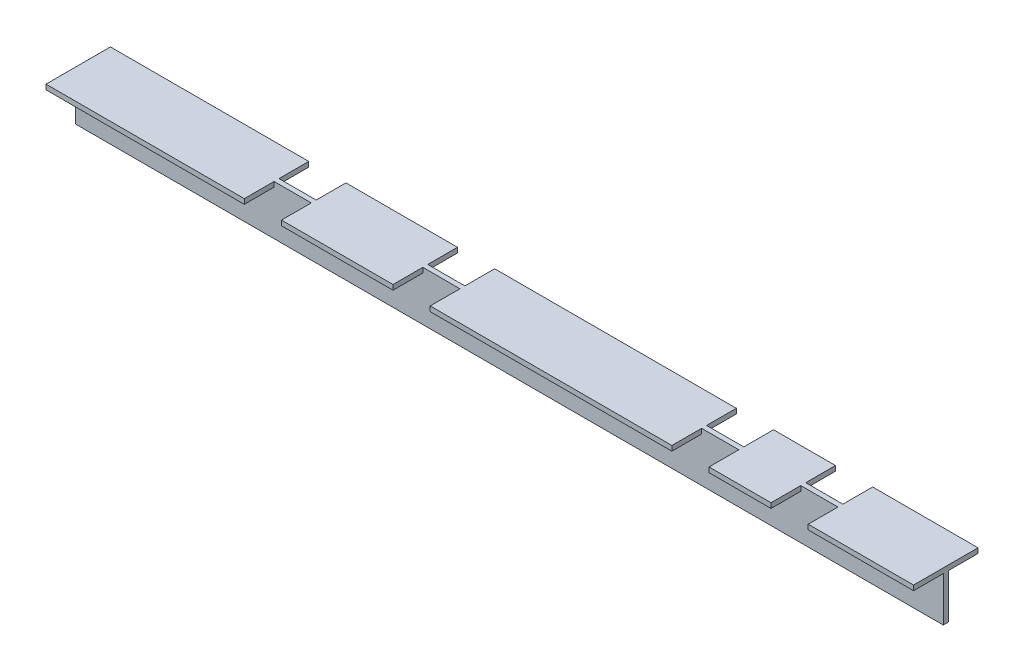
ISO-10303-21;
HEADER;
FILE_DESCRIPTION(('STEP AP214'),'2;1');
FILE_NAME('part.step','',(''),(''),'','','');
FILE_SCHEMA(('AUTOMOTIVE_DESIGN { 1 0 10303 214 1 1 1 1 }'));
ENDSEC;
DATA;
#1=APPLICATION_CONTEXT('core data for automotive mechanical design processes');
#2=APPLICATION_PROTOCOL_DEFINITION('international standard','automotive_design',2000,#1);
#3=PRODUCT_CONTEXT('',#1,'mechanical');
#4=PRODUCT('Part','Part','',(#3));
#5=PRODUCT_RELATED_PRODUCT_CATEGORY('part','',(#4));
#6=PRODUCT_DEFINITION_FORMATION('','',#4);
#7=PRODUCT_DEFINITION_CONTEXT('part definition',#1,'design');
#8=PRODUCT_DEFINITION('design','',#6,#7);
#9=PRODUCT_DEFINITION_SHAPE('','',#8);
#10=(LENGTH_UNIT() NAMED_UNIT(*) SI_UNIT(.MILLI.,.METRE.));
#11=(NAMED_UNIT(*) PLANE_ANGLE_UNIT() SI_UNIT($,.RADIAN.));
#12=(NAMED_UNIT(*) SI_UNIT($,.STERADIAN.) SOLID_ANGLE_UNIT());
#13=UNCERTAINTY_MEASURE_WITH_UNIT(LENGTH_MEASURE(1.E-05),#10,'distance_accuracy_value','');
#14=(GEOMETRIC_REPRESENTATION_CONTEXT(3) GLOBAL_UNCERTAINTY_ASSIGNED_CONTEXT((#13)) GLOBAL_UNIT_ASSIGNED_CONTEXT((#10,
#11,#12)) REPRESENTATION_CONTEXT('',''));
#15=CARTESIAN_POINT('',(0.,0.,0.));
#16=DIRECTION('',(0.,0.,1.));
#17=DIRECTION('',(1.,0.,0.));
#18=AXIS2_PLACEMENT_3D('',#15,#16,#17);
#19=CARTESIAN_POINT('',(1400.,0.,0.));
#20=DIRECTION('',(0.,0.,-1.));
#21=DIRECTION('',(-1.,0.,0.));
#22=AXIS2_PLACEMENT_3D('',#19,#20,#21);
#23=PLANE('',#22);
#24=DIRECTION('',(-1.,0.,0.));
#25=VECTOR('',#24,1.);
#26=CARTESIAN_POINT('',(1400.,0.,0.));
#27=LINE('',#26,#25);
#28=CARTESIAN_POINT('',(1010.,0.,0.));
#29=VERTEX_POINT('',#28);
#30=CARTESIAN_POINT('',(620.,0.,0.));
#31=VERTEX_POINT('',#30);
#32=EDGE_CURVE('E687',#29,#31,#27,.T.);
#33=ORIENTED_EDGE('',*,*,#32,.T.);
#34=DIRECTION('',(0.,-1.,0.));
#35=VECTOR('',#34,1.);
#36=CARTESIAN_POINT('',(620.,0.,0.));
#37=LINE('',#36,#35);
#38=CARTESIAN_POINT('',(620.,-8.,0.));
#39=VERTEX_POINT('',#38);
#40=EDGE_CURVE('E423',#31,#39,#37,.T.);
#41=ORIENTED_EDGE('',*,*,#40,.T.);
#42=DIRECTION('',(-1.,0.,0.));
#43=VECTOR('',#42,1.);
#44=CARTESIAN_POINT('',(1400.,-8.,0.));
#45=LINE('',#44,#43);
#46=CARTESIAN_POINT('',(1010.,-8.,0.));
#47=VERTEX_POINT('',#46);
#48=EDGE_CURVE('E680',#47,#39,#45,.T.);
#49=ORIENTED_EDGE('',*,*,#48,.F.);
#50=DIRECTION('',(0.,-1.,0.));
#51=VECTOR('',#50,1.);
#52=CARTESIAN_POINT('',(1010.,0.,0.));
#53=LINE('',#52,#51);
#54=EDGE_CURVE('E406',#29,#47,#53,.T.);
#55=ORIENTED_EDGE('',*,*,#54,.F.);
#56=EDGE_LOOP('',(#33,#41,#49,#55));
#57=FACE_BOUND('',#56,.T.);
#58=ADVANCED_FACE('F41',(#57),#23,.F.);
#59=CARTESIAN_POINT('',(1400.,0.,0.));
#60=VERTEX_POINT('',#59);
#61=CARTESIAN_POINT('',(1230.,0.,0.));
#62=VERTEX_POINT('',#61);
#63=EDGE_CURVE('E621',#60,#62,#27,.T.);
#64=ORIENTED_EDGE('',*,*,#63,.T.);
#65=DIRECTION('',(0.,-1.,0.));
#66=VECTOR('',#65,1.);
#67=CARTESIAN_POINT('',(1230.,0.,0.));
#68=LINE('',#67,#66);
#69=CARTESIAN_POINT('',(1230.,-8.,0.));
#70=VERTEX_POINT('',#69);
#71=EDGE_CURVE('E455',#62,#70,#68,.T.);
#72=ORIENTED_EDGE('',*,*,#71,.T.);
#73=CARTESIAN_POINT('',(1400.,-8.,0.));
#74=VERTEX_POINT('',#73);
#75=EDGE_CURVE('E11',#74,#70,#45,.T.);
#76=ORIENTED_EDGE('',*,*,#75,.F.);
#77=DIRECTION('',(0.,-1.,0.));
#78=VECTOR('',#77,1.);
#79=CARTESIAN_POINT('',(1400.,0.,0.));
#80=LINE('',#79,#78);
#81=EDGE_CURVE('E567',#60,#74,#80,.T.);
#82=ORIENTED_EDGE('',*,*,#81,.F.);
#83=EDGE_LOOP('',(#64,#72,#76,#82));
#84=FACE_BOUND('',#83,.T.);
#85=ADVANCED_FACE('F758',(#84),#23,.F.);
#86=CARTESIAN_POINT('',(1170.,-8.,0.));
#87=VERTEX_POINT('',#86);
#88=CARTESIAN_POINT('',(1070.,-8.,0.));
#89=VERTEX_POINT('',#88);
#90=EDGE_CURVE('E50',#87,#89,#45,.T.);
#91=ORIENTED_EDGE('',*,*,#90,.F.);
#92=DIRECTION('',(0.,-1.,0.));
#93=VECTOR('',#92,1.);
#94=CARTESIAN_POINT('',(1170.,0.,0.));
#95=LINE('',#94,#93);
#96=CARTESIAN_POINT('',(1170.,0.,0.));
#97=VERTEX_POINT('',#96);
#98=EDGE_CURVE('E468',#97,#87,#95,.T.);
#99=ORIENTED_EDGE('',*,*,#98,.F.);
#100=CARTESIAN_POINT('',(1070.,0.,0.));
#101=VERTEX_POINT('',#100);
#102=EDGE_CURVE('E626',#97,#101,#27,.T.);
#103=ORIENTED_EDGE('',*,*,#102,.T.);
#104=DIRECTION('',(0.,-1.,0.));
#105=VECTOR('',#104,1.);
#106=CARTESIAN_POINT('',(1070.,0.,0.));
#107=LINE('',#106,#105);
#108=EDGE_CURVE('E395',#101,#89,#107,.T.);
#109=ORIENTED_EDGE('',*,*,#108,.T.);
#110=EDGE_LOOP('',(#91,#99,#103,#109));
#111=FACE_BOUND('',#110,.T.);
#112=ADVANCED_FACE('F739',(#111),#23,.F.);
#113=CARTESIAN_POINT('',(560.,-8.,0.));
#114=VERTEX_POINT('',#113);
#115=CARTESIAN_POINT('',(380.,-8.,0.));
#116=VERTEX_POINT('',#115);
#117=EDGE_CURVE('E659',#114,#116,#45,.T.);
#118=ORIENTED_EDGE('',*,*,#117,.F.);
#119=DIRECTION('',(0.,-1.,0.));
#120=VECTOR('',#119,1.);
#121=CARTESIAN_POINT('',(560.,0.,0.));
#122=LINE('',#121,#120);
#123=CARTESIAN_POINT('',(560.,0.,0.));
#124=VERTEX_POINT('',#123);
#125=EDGE_CURVE('E438',#124,#114,#122,.T.);
#126=ORIENTED_EDGE('',*,*,#125,.F.);
#127=CARTESIAN_POINT('',(380.,0.,0.));
#128=VERTEX_POINT('',#127);
#129=EDGE_CURVE('E689',#124,#128,#27,.T.);
#130=ORIENTED_EDGE('',*,*,#129,.T.);
#131=DIRECTION('',(0.,-1.,0.));
#132=VECTOR('',#131,1.);
#133=CARTESIAN_POINT('',(380.,0.,0.));
#134=LINE('',#133,#132);
#135=EDGE_CURVE('E548',#128,#116,#134,.T.);
#136=ORIENTED_EDGE('',*,*,#135,.T.);
#137=EDGE_LOOP('',(#118,#126,#130,#136));
#138=FACE_BOUND('',#137,.T.);
#139=ADVANCED_FACE('F723',(#138),#23,.F.);
#140=CARTESIAN_POINT('',(1400.,-8.,0.));
#141=DIRECTION('',(0.,1.,0.));
#142=DIRECTION('',(0.,0.,1.));
#143=AXIS2_PLACEMENT_3D('',#140,#141,#142);
#144=PLANE('',#143);
#145=ORIENTED_EDGE('',*,*,#48,.T.);
#146=DIRECTION('',(0.,0.,1.));
#147=VECTOR('',#146,1.);
#148=CARTESIAN_POINT('',(620.,-7.99999999999998,-48.));
#149=LINE('',#148,#147);
#150=CARTESIAN_POINT('',(620.,-7.99999999999998,-48.));
#151=VERTEX_POINT('',#150);
#152=EDGE_CURVE('E424',#151,#39,#149,.T.);
#153=ORIENTED_EDGE('',*,*,#152,.F.);
#154=DIRECTION('',(-1.,0.,0.));
#155=VECTOR('',#154,1.);
#156=CARTESIAN_POINT('',(1400.,-7.99999999999999,-48.));
#157=LINE('',#156,#155);
#158=CARTESIAN_POINT('',(1010.,-7.99999999999998,-48.));
#159=VERTEX_POINT('',#158);
#160=EDGE_CURVE('E661',#159,#151,#157,.T.);
#161=ORIENTED_EDGE('',*,*,#160,.F.);
#162=DIRECTION('',(0.,0.,-1.));
#163=VECTOR('',#162,1.);
#164=CARTESIAN_POINT('',(1010.,-8.,0.));
#165=LINE('',#164,#163);
#166=EDGE_CURVE('E387',#47,#159,#165,.T.);
#167=ORIENTED_EDGE('',*,*,#166,.F.);
#168=EDGE_LOOP('',(#145,#153,#161,#167));
#169=FACE_BOUND('',#168,.T.);
#170=ADVANCED_FACE('F678',(#169),#144,.F.);
#171=ORIENTED_EDGE('',*,*,#75,.T.);
#172=DIRECTION('',(0.,0.,1.));
#173=VECTOR('',#172,1.);
#174=CARTESIAN_POINT('',(1230.,-7.99999999999998,-48.));
#175=LINE('',#174,#173);
#176=CARTESIAN_POINT('',(1230.,-7.99999999999998,-48.));
#177=VERTEX_POINT('',#176);
#178=EDGE_CURVE('E456',#177,#70,#175,.T.);
#179=ORIENTED_EDGE('',*,*,#178,.F.);
#180=CARTESIAN_POINT('',(1400.,-7.99999999999999,-48.));
#181=VERTEX_POINT('',#180);
#182=EDGE_CURVE('E651',#181,#177,#157,.T.);
#183=ORIENTED_EDGE('',*,*,#182,.F.);
#184=DIRECTION('',(0.,0.,-1.));
#185=VECTOR('',#184,1.);
#186=CARTESIAN_POINT('',(1400.,-8.,0.));
#187=LINE('',#186,#185);
#188=EDGE_CURVE('E571',#74,#181,#187,.T.);
#189=ORIENTED_EDGE('',*,*,#188,.F.);
#190=EDGE_LOOP('',(#171,#179,#183,#189));
#191=FACE_BOUND('',#190,.T.);
#192=ADVANCED_FACE('F778',(#191),#144,.F.);
#193=CARTESIAN_POINT('',(1170.,-7.99999999999998,-48.));
#194=VERTEX_POINT('',#193);
#195=CARTESIAN_POINT('',(1070.,-7.99999999999998,-48.));
#196=VERTEX_POINT('',#195);
#197=EDGE_CURVE('E654',#194,#196,#157,.T.);
#198=ORIENTED_EDGE('',*,*,#197,.F.);
#199=DIRECTION('',(0.,0.,-1.));
#200=VECTOR('',#199,1.);
#201=CARTESIAN_POINT('',(1170.,-7.99999999999998,-48.));
#202=LINE('',#201,#200);
#203=EDGE_CURVE('E449',#87,#194,#202,.T.);
#204=ORIENTED_EDGE('',*,*,#203,.F.);
#205=ORIENTED_EDGE('',*,*,#90,.T.);
#206=DIRECTION('',(0.,0.,1.));
#207=VECTOR('',#206,1.);
#208=CARTESIAN_POINT('',(1070.,-8.,0.));
#209=LINE('',#208,#207);
#210=EDGE_CURVE('E341',#196,#89,#209,.T.);
#211=ORIENTED_EDGE('',*,*,#210,.F.);
#212=EDGE_LOOP('',(#198,#204,#205,#211));
#213=FACE_BOUND('',#212,.T.);
#214=ADVANCED_FACE('F736',(#213),#144,.F.);
#215=CARTESIAN_POINT('',(560.,-7.99999999999998,-48.));
#216=VERTEX_POINT('',#215);
#217=CARTESIAN_POINT('',(380.,-7.99999999999998,-48.));
#218=VERTEX_POINT('',#217);
#219=EDGE_CURVE('E663',#216,#218,#157,.T.);
#220=ORIENTED_EDGE('',*,*,#219,.F.);
#221=DIRECTION('',(0.,0.,-1.));
#222=VECTOR('',#221,1.);
#223=CARTESIAN_POINT('',(560.,-7.99999999999998,-48.));
#224=LINE('',#223,#222);
#225=EDGE_CURVE('E417',#114,#216,#224,.T.);
#226=ORIENTED_EDGE('',*,*,#225,.F.);
#227=ORIENTED_EDGE('',*,*,#117,.T.);
#228=DIRECTION('',(0.,0.,1.));
#229=VECTOR('',#228,1.);
#230=CARTESIAN_POINT('',(380.,-7.99999999999998,-48.));
#231=LINE('',#230,#229);
#232=EDGE_CURVE('E434',#218,#116,#231,.T.);
#233=ORIENTED_EDGE('',*,*,#232,.F.);
#234=EDGE_LOOP('',(#220,#226,#227,#233));
#235=FACE_BOUND('',#234,.T.);
#236=ADVANCED_FACE('F726',(#235),#144,.F.);
#237=CARTESIAN_POINT('',(1400.,-7.99999999999999,-56.));
#238=DIRECTION('',(0.,1.,0.));
#239=DIRECTION('',(0.,0.,1.));
#240=AXIS2_PLACEMENT_3D('',#237,#238,#239);
#241=PLANE('',#240);
#242=DIRECTION('',(-1.,0.,0.));
#243=VECTOR('',#242,1.);
#244=CARTESIAN_POINT('',(1400.,-7.99999999999999,-56.));
#245=LINE('',#244,#243);
#246=CARTESIAN_POINT('',(1400.,-7.99999999999999,-56.));
#247=VERTEX_POINT('',#246);
#248=CARTESIAN_POINT('',(1230.,-7.99999999999998,-56.));
#249=VERTEX_POINT('',#248);
#250=EDGE_CURVE('E638',#247,#249,#245,.T.);
#251=ORIENTED_EDGE('',*,*,#250,.T.);
#252=DIRECTION('',(0.,0.,1.));
#253=VECTOR('',#252,1.);
#254=CARTESIAN_POINT('',(1230.,-7.99999999999996,-104.));
#255=LINE('',#254,#253);
#256=CARTESIAN_POINT('',(1230.,-7.99999999999996,-104.));
#257=VERTEX_POINT('',#256);
#258=EDGE_CURVE('E487',#257,#249,#255,.T.);
#259=ORIENTED_EDGE('',*,*,#258,.F.);
#260=DIRECTION('',(-1.,0.,0.));
#261=VECTOR('',#260,1.);
#262=CARTESIAN_POINT('',(1400.,-7.99999999999999,-104.));
#263=LINE('',#262,#261);
#264=CARTESIAN_POINT('',(1400.,-7.99999999999999,-104.));
#265=VERTEX_POINT('',#264);
#266=EDGE_CURVE('E632',#265,#257,#263,.T.);
#267=ORIENTED_EDGE('',*,*,#266,.F.);
#268=DIRECTION('',(0.,0.,-1.));
#269=VECTOR('',#268,1.);
#270=CARTESIAN_POINT('',(1400.,-7.99999999999999,-56.));
#271=LINE('',#270,#269);
#272=EDGE_CURVE('E584',#247,#265,#271,.T.);
#273=ORIENTED_EDGE('',*,*,#272,.F.);
#274=EDGE_LOOP('',(#251,#259,#267,#273));
#275=FACE_BOUND('',#274,.T.);
#276=ADVANCED_FACE('F844',(#275),#241,.F.);
#277=CARTESIAN_POINT('',(1010.,-7.99999999999998,-56.));
#278=VERTEX_POINT('',#277);
#279=CARTESIAN_POINT('',(620.,-7.99999999999998,-56.0000000000003));
#280=VERTEX_POINT('',#279);
#281=EDGE_CURVE('E1039',#278,#280,#245,.T.);
#282=ORIENTED_EDGE('',*,*,#281,.T.);
#283=DIRECTION('',(0.,0.,1.));
#284=VECTOR('',#283,1.);
#285=CARTESIAN_POINT('',(620.,-7.99999999999996,-104.));
#286=LINE('',#285,#284);
#287=CARTESIAN_POINT('',(620.,-7.99999999999996,-104.));
#288=VERTEX_POINT('',#287);
#289=EDGE_CURVE('E372',#288,#280,#286,.T.);
#290=ORIENTED_EDGE('',*,*,#289,.F.);
#291=CARTESIAN_POINT('',(1010.,-7.99999999999996,-104.));
#292=VERTEX_POINT('',#291);
#293=EDGE_CURVE('E1052',#292,#288,#263,.T.);
#294=ORIENTED_EDGE('',*,*,#293,.F.);
#295=DIRECTION('',(0.,0.,-1.));
#296=VECTOR('',#295,1.);
#297=CARTESIAN_POINT('',(1010.,-7.99999999999998,-56.));
#298=LINE('',#297,#296);
#299=EDGE_CURVE('E329',#278,#292,#298,.T.);
#300=ORIENTED_EDGE('',*,*,#299,.F.);
#301=EDGE_LOOP('',(#282,#290,#294,#300));
#302=FACE_BOUND('',#301,.T.);
#303=ADVANCED_FACE('F1064',(#302),#241,.F.);
#304=CARTESIAN_POINT('',(1170.,-7.99999999999996,-104.));
#305=VERTEX_POINT('',#304);
#306=CARTESIAN_POINT('',(1070.,-7.99999999999996,-104.));
#307=VERTEX_POINT('',#306);
#308=EDGE_CURVE('E637',#305,#307,#263,.T.);
#309=ORIENTED_EDGE('',*,*,#308,.F.);
#310=DIRECTION('',(0.,0.,-1.));
#311=VECTOR('',#310,1.);
#312=CARTESIAN_POINT('',(1170.,-7.99999999999996,-104.));
#313=LINE('',#312,#311);
#314=CARTESIAN_POINT('',(1170.,-7.99999999999998,-56.));
#315=VERTEX_POINT('',#314);
#316=EDGE_CURVE('E479',#315,#305,#313,.T.);
#317=ORIENTED_EDGE('',*,*,#316,.F.);
#318=CARTESIAN_POINT('',(1070.,-7.99999999999998,-56.));
#319=VERTEX_POINT('',#318);
#320=EDGE_CURVE('E643',#315,#319,#245,.T.);
#321=ORIENTED_EDGE('',*,*,#320,.T.);
#322=DIRECTION('',(0.,0.,1.));
#323=VECTOR('',#322,1.);
#324=CARTESIAN_POINT('',(1070.,-7.99999999999998,-56.));
#325=LINE('',#324,#323);
#326=EDGE_CURVE('E305',#307,#319,#325,.T.);
#327=ORIENTED_EDGE('',*,*,#326,.F.);
#328=EDGE_LOOP('',(#309,#317,#321,#327));
#329=FACE_BOUND('',#328,.T.);
#330=ADVANCED_FACE('F1061',(#329),#241,.F.);
#331=CARTESIAN_POINT('',(560.,-7.99999999999996,-104.));
#332=VERTEX_POINT('',#331);
#333=CARTESIAN_POINT('',(380.,-7.99999999999996,-104.));
#334=VERTEX_POINT('',#333);
#335=EDGE_CURVE('E1030',#332,#334,#263,.T.);
#336=ORIENTED_EDGE('',*,*,#335,.F.);
#337=DIRECTION('',(0.,0.,-1.));
#338=VECTOR('',#337,1.);
#339=CARTESIAN_POINT('',(560.,-7.99999999999996,-104.));
#340=LINE('',#339,#338);
#341=CARTESIAN_POINT('',(560.,-7.99999999999998,-56.));
#342=VERTEX_POINT('',#341);
#343=EDGE_CURVE('E510',#342,#332,#340,.T.);
#344=ORIENTED_EDGE('',*,*,#343,.F.);
#345=CARTESIAN_POINT('',(380.,-7.99999999999998,-56.0000000000004));
#346=VERTEX_POINT('',#345);
#347=EDGE_CURVE('E1036',#342,#346,#245,.T.);
#348=ORIENTED_EDGE('',*,*,#347,.T.);
#349=DIRECTION('',(0.,0.,1.));
#350=VECTOR('',#349,1.);
#351=CARTESIAN_POINT('',(380.,-7.99999999999996,-104.));
#352=LINE('',#351,#350);
#353=EDGE_CURVE('E362',#334,#346,#352,.T.);
#354=ORIENTED_EDGE('',*,*,#353,.F.);
#355=EDGE_LOOP('',(#336,#344,#348,#354));
#356=FACE_BOUND('',#355,.T.);
#357=ADVANCED_FACE('F845',(#356),#241,.F.);
#358=CARTESIAN_POINT('',(1400.,0.,-104.));
#359=DIRECTION('',(0.,0.,1.));
#360=DIRECTION('',(1.,0.,0.));
#361=AXIS2_PLACEMENT_3D('',#358,#359,#360);
#362=PLANE('',#361);
#363=ORIENTED_EDGE('',*,*,#266,.T.);
#364=DIRECTION('',(0.,-1.,0.));
#365=VECTOR('',#364,1.);
#366=CARTESIAN_POINT('',(1230.,0.,-104.));
#367=LINE('',#366,#365);
#368=CARTESIAN_POINT('',(1230.,0.,-104.));
#369=VERTEX_POINT('',#368);
#370=EDGE_CURVE('E459',#369,#257,#367,.T.);
#371=ORIENTED_EDGE('',*,*,#370,.F.);
#372=DIRECTION('',(-1.,0.,0.));
#373=VECTOR('',#372,1.);
#374=CARTESIAN_POINT('',(1400.,0.,-104.));
#375=LINE('',#374,#373);
#376=CARTESIAN_POINT('',(1400.,0.,-104.));
#377=VERTEX_POINT('',#376);
#378=EDGE_CURVE('E627',#377,#369,#375,.T.);
#379=ORIENTED_EDGE('',*,*,#378,.F.);
#380=DIRECTION('',(0.,1.,0.));
#381=VECTOR('',#380,1.);
#382=CARTESIAN_POINT('',(1400.,0.,-104.));
#383=LINE('',#382,#381);
#384=EDGE_CURVE('E587',#265,#377,#383,.T.);
#385=ORIENTED_EDGE('',*,*,#384,.F.);
#386=EDGE_LOOP('',(#363,#371,#379,#385));
#387=FACE_BOUND('',#386,.T.);
#388=ADVANCED_FACE('F851',(#387),#362,.F.);
#389=ORIENTED_EDGE('',*,*,#293,.T.);
#390=DIRECTION('',(0.,-1.,0.));
#391=VECTOR('',#390,1.);
#392=CARTESIAN_POINT('',(620.,0.,-104.));
#393=LINE('',#392,#391);
#394=CARTESIAN_POINT('',(620.,0.,-104.));
#395=VERTEX_POINT('',#394);
#396=EDGE_CURVE('E491',#395,#288,#393,.T.);
#397=ORIENTED_EDGE('',*,*,#396,.F.);
#398=CARTESIAN_POINT('',(1010.,0.,-104.));
#399=VERTEX_POINT('',#398);
#400=EDGE_CURVE('E1018',#399,#395,#375,.T.);
#401=ORIENTED_EDGE('',*,*,#400,.F.);
#402=DIRECTION('',(0.,-1.,0.));
#403=VECTOR('',#402,1.);
#404=CARTESIAN_POINT('',(1010.,0.,-104.));
#405=LINE('',#404,#403);
#406=EDGE_CURVE('E342',#399,#292,#405,.T.);
#407=ORIENTED_EDGE('',*,*,#406,.T.);
#408=EDGE_LOOP('',(#389,#397,#401,#407));
#409=FACE_BOUND('',#408,.T.);
#410=ADVANCED_FACE('F1076',(#409),#362,.F.);
#411=CARTESIAN_POINT('',(1170.,0.,-104.));
#412=VERTEX_POINT('',#411);
#413=CARTESIAN_POINT('',(1070.,0.,-104.));
#414=VERTEX_POINT('',#413);
#415=EDGE_CURVE('E327',#412,#414,#375,.T.);
#416=ORIENTED_EDGE('',*,*,#415,.F.);
#417=DIRECTION('',(0.,-1.,0.));
#418=VECTOR('',#417,1.);
#419=CARTESIAN_POINT('',(1170.,0.,-104.));
#420=LINE('',#419,#418);
#421=EDGE_CURVE('E496',#412,#305,#420,.T.);
#422=ORIENTED_EDGE('',*,*,#421,.T.);
#423=ORIENTED_EDGE('',*,*,#308,.T.);
#424=DIRECTION('',(0.,-1.,0.));
#425=VECTOR('',#424,1.);
#426=CARTESIAN_POINT('',(1070.,0.,-104.));
#427=LINE('',#426,#425);
#428=EDGE_CURVE('E338',#414,#307,#427,.T.);
#429=ORIENTED_EDGE('',*,*,#428,.F.);
#430=EDGE_LOOP('',(#416,#422,#423,#429));
#431=FACE_BOUND('',#430,.T.);
#432=ADVANCED_FACE('F769',(#431),#362,.F.);
#433=CARTESIAN_POINT('',(560.,0.,-104.));
#434=VERTEX_POINT('',#433);
#435=CARTESIAN_POINT('',(380.,0.,-104.));
#436=VERTEX_POINT('',#435);
#437=EDGE_CURVE('E1021',#434,#436,#375,.T.);
#438=ORIENTED_EDGE('',*,*,#437,.F.);
#439=DIRECTION('',(0.,-1.,0.));
#440=VECTOR('',#439,1.);
#441=CARTESIAN_POINT('',(560.,0.,-104.));
#442=LINE('',#441,#440);
#443=EDGE_CURVE('E526',#434,#332,#442,.T.);
#444=ORIENTED_EDGE('',*,*,#443,.T.);
#445=ORIENTED_EDGE('',*,*,#335,.T.);
#446=DIRECTION('',(0.,-1.,0.));
#447=VECTOR('',#446,1.);
#448=CARTESIAN_POINT('',(380.,0.,-104.));
#449=LINE('',#448,#447);
#450=EDGE_CURVE('E369',#436,#334,#449,.T.);
#451=ORIENTED_EDGE('',*,*,#450,.F.);
#452=EDGE_LOOP('',(#438,#444,#445,#451));
#453=FACE_BOUND('',#452,.T.);
#454=ADVANCED_FACE('F764',(#453),#362,.F.);
#455=CARTESIAN_POINT('',(320.,-8.,0.));
#456=VERTEX_POINT('',#455);
#457=CARTESIAN_POINT('',(0.,-8.,0.));
#458=VERTEX_POINT('',#457);
#459=EDGE_CURVE('E51',#456,#458,#45,.T.);
#460=ORIENTED_EDGE('',*,*,#459,.F.);
#461=DIRECTION('',(0.,-1.,0.));
#462=VECTOR('',#461,1.);
#463=CARTESIAN_POINT('',(320.,0.,0.));
#464=LINE('',#463,#462);
#465=CARTESIAN_POINT('',(320.,0.,0.));
#466=VERTEX_POINT('',#465);
#467=EDGE_CURVE('E561',#466,#456,#464,.T.);
#468=ORIENTED_EDGE('',*,*,#467,.F.);
#469=CARTESIAN_POINT('',(0.,0.,0.));
#470=VERTEX_POINT('',#469);
#471=EDGE_CURVE('E593',#466,#470,#27,.T.);
#472=ORIENTED_EDGE('',*,*,#471,.T.);
#473=DIRECTION('',(0.,-1.,0.));
#474=VECTOR('',#473,1.);
#475=CARTESIAN_POINT('',(0.,0.,0.));
#476=LINE('',#475,#474);
#477=EDGE_CURVE('E557',#470,#458,#476,.T.);
#478=ORIENTED_EDGE('',*,*,#477,.T.);
#479=EDGE_LOOP('',(#460,#468,#472,#478));
#480=FACE_BOUND('',#479,.T.);
#481=ADVANCED_FACE('F43',(#480),#23,.F.);
#482=CARTESIAN_POINT('',(320.,-7.99999999999998,-48.));
#483=VERTEX_POINT('',#482);
#484=CARTESIAN_POINT('',(0.,-7.99999999999999,-48.));
#485=VERTEX_POINT('',#484);
#486=EDGE_CURVE('E650',#483,#485,#157,.T.);
#487=ORIENTED_EDGE('',*,*,#486,.F.);
#488=DIRECTION('',(0.,0.,-1.));
#489=VECTOR('',#488,1.);
#490=CARTESIAN_POINT('',(320.,-7.99999999999998,-48.));
#491=LINE('',#490,#489);
#492=EDGE_CURVE('E540',#456,#483,#491,.T.);
#493=ORIENTED_EDGE('',*,*,#492,.F.);
#494=ORIENTED_EDGE('',*,*,#459,.T.);
#495=DIRECTION('',(0.,0.,-1.));
#496=VECTOR('',#495,1.);
#497=CARTESIAN_POINT('',(0.,-8.,0.));
#498=LINE('',#497,#496);
#499=EDGE_CURVE('E597',#458,#485,#498,.T.);
#500=ORIENTED_EDGE('',*,*,#499,.T.);
#501=EDGE_LOOP('',(#487,#493,#494,#500));
#502=FACE_BOUND('',#501,.T.);
#503=ADVANCED_FACE('F712',(#502),#144,.F.);
#504=CARTESIAN_POINT('',(1400.,-7.99999999999999,-48.));
#505=DIRECTION('',(0.,0.,-1.));
#506=DIRECTION('',(0.,1.,0.));
#507=AXIS2_PLACEMENT_3D('',#504,#505,#506);
#508=PLANE('',#507);
#509=DIRECTION('',(0.,-1.,0.));
#510=VECTOR('',#509,1.);
#511=CARTESIAN_POINT('',(0.,-7.99999999999999,-48.));
#512=LINE('',#511,#510);
#513=CARTESIAN_POINT('',(0.,-80.,-48.));
#514=VERTEX_POINT('',#513);
#515=EDGE_CURVE('E601',#485,#514,#512,.T.);
#516=ORIENTED_EDGE('',*,*,#515,.T.);
#517=DIRECTION('',(-1.,0.,0.));
#518=VECTOR('',#517,1.);
#519=CARTESIAN_POINT('',(1400.,-80.,-48.));
#520=LINE('',#519,#518);
#521=CARTESIAN_POINT('',(1400.,-80.,-48.));
#522=VERTEX_POINT('',#521);
#523=EDGE_CURVE('E647',#522,#514,#520,.T.);
#524=ORIENTED_EDGE('',*,*,#523,.F.);
#525=DIRECTION('',(0.,-1.,0.));
#526=VECTOR('',#525,1.);
#527=CARTESIAN_POINT('',(1400.,-7.99999999999999,-48.));
#528=LINE('',#527,#526);
#529=EDGE_CURVE('E575',#181,#522,#528,.T.);
#530=ORIENTED_EDGE('',*,*,#529,.F.);
#531=ORIENTED_EDGE('',*,*,#182,.T.);
#532=DIRECTION('',(0.,-1.,0.));
#533=VECTOR('',#532,1.);
#534=CARTESIAN_POINT('',(1230.,0.,-48.));
#535=LINE('',#534,#533);
#536=CARTESIAN_POINT('',(1230.,0.,-48.));
#537=VERTEX_POINT('',#536);
#538=EDGE_CURVE('E427',#537,#177,#535,.T.);
#539=ORIENTED_EDGE('',*,*,#538,.F.);
#540=DIRECTION('',(1.,0.,0.));
#541=VECTOR('',#540,1.);
#542=CARTESIAN_POINT('',(1230.,0.,-48.));
#543=LINE('',#542,#541);
#544=CARTESIAN_POINT('',(1170.,0.,-48.));
#545=VERTEX_POINT('',#544);
#546=EDGE_CURVE('E65',#545,#537,#543,.T.);
#547=ORIENTED_EDGE('',*,*,#546,.F.);
#548=DIRECTION('',(0.,-1.,0.));
#549=VECTOR('',#548,1.);
#550=CARTESIAN_POINT('',(1170.,0.,-48.));
#551=LINE('',#550,#549);
#552=EDGE_CURVE('E465',#545,#194,#551,.T.);
#553=ORIENTED_EDGE('',*,*,#552,.T.);
#554=ORIENTED_EDGE('',*,*,#197,.T.);
#555=DIRECTION('',(0.,-1.,0.));
#556=VECTOR('',#555,1.);
#557=CARTESIAN_POINT('',(1070.,0.,-48.));
#558=LINE('',#557,#556);
#559=CARTESIAN_POINT('',(1070.,0.,-48.));
#560=VERTEX_POINT('',#559);
#561=EDGE_CURVE('E366',#560,#196,#558,.T.);
#562=ORIENTED_EDGE('',*,*,#561,.F.);
#563=DIRECTION('',(1.,0.,0.));
#564=VECTOR('',#563,1.);
#565=CARTESIAN_POINT('',(1070.,0.,-48.));
#566=LINE('',#565,#564);
#567=CARTESIAN_POINT('',(1010.,0.,-48.));
#568=VERTEX_POINT('',#567);
#569=EDGE_CURVE('E391',#568,#560,#566,.T.);
#570=ORIENTED_EDGE('',*,*,#569,.F.);
#571=DIRECTION('',(0.,-1.,0.));
#572=VECTOR('',#571,1.);
#573=CARTESIAN_POINT('',(1010.,0.,-48.));
#574=LINE('',#573,#572);
#575=EDGE_CURVE('E403',#568,#159,#574,.T.);
#576=ORIENTED_EDGE('',*,*,#575,.T.);
#577=ORIENTED_EDGE('',*,*,#160,.T.);
#578=DIRECTION('',(0.,-1.,0.));
#579=VECTOR('',#578,1.);
#580=CARTESIAN_POINT('',(620.,0.,-48.));
#581=LINE('',#580,#579);
#582=CARTESIAN_POINT('',(620.,0.,-48.));
#583=VERTEX_POINT('',#582);
#584=EDGE_CURVE('E431',#583,#151,#581,.T.);
#585=ORIENTED_EDGE('',*,*,#584,.F.);
#586=DIRECTION('',(1.,0.,0.));
#587=VECTOR('',#586,1.);
#588=CARTESIAN_POINT('',(620.,0.,-48.));
#589=LINE('',#588,#587);
#590=CARTESIAN_POINT('',(560.,0.,-48.));
#591=VERTEX_POINT('',#590);
#592=EDGE_CURVE('E58',#591,#583,#589,.T.);
#593=ORIENTED_EDGE('',*,*,#592,.F.);
#594=DIRECTION('',(0.,-1.,0.));
#595=VECTOR('',#594,1.);
#596=CARTESIAN_POINT('',(560.,0.,-48.));
#597=LINE('',#596,#595);
#598=EDGE_CURVE('E435',#591,#216,#597,.T.);
#599=ORIENTED_EDGE('',*,*,#598,.T.);
#600=ORIENTED_EDGE('',*,*,#219,.T.);
#601=DIRECTION('',(0.,-1.,0.));
#602=VECTOR('',#601,1.);
#603=CARTESIAN_POINT('',(380.,0.,-48.));
#604=LINE('',#603,#602);
#605=CARTESIAN_POINT('',(380.,0.,-48.));
#606=VERTEX_POINT('',#605);
#607=EDGE_CURVE('E554',#606,#218,#604,.T.);
#608=ORIENTED_EDGE('',*,*,#607,.F.);
#609=DIRECTION('',(1.,0.,0.));
#610=VECTOR('',#609,1.);
#611=CARTESIAN_POINT('',(380.,0.,-48.));
#612=LINE('',#611,#610);
#613=CARTESIAN_POINT('',(320.,0.,-48.));
#614=VERTEX_POINT('',#613);
#615=EDGE_CURVE('E544',#614,#606,#612,.T.);
#616=ORIENTED_EDGE('',*,*,#615,.F.);
#617=DIRECTION('',(0.,-1.,0.));
#618=VECTOR('',#617,1.);
#619=CARTESIAN_POINT('',(320.,0.,-48.));
#620=LINE('',#619,#618);
#621=EDGE_CURVE('E558',#614,#483,#620,.T.);
#622=ORIENTED_EDGE('',*,*,#621,.T.);
#623=ORIENTED_EDGE('',*,*,#486,.T.);
#624=EDGE_LOOP('',(#516,#524,#530,#531,#539,#547,#553,#554,#562,#570,#576,#577,#585,#593,#599,
#600,#608,#616,#622,#623));
#625=FACE_BOUND('',#624,.T.);
#626=ADVANCED_FACE('F671',(#625),#508,.F.);
#627=CARTESIAN_POINT('',(1400.,-80.,-48.));
#628=DIRECTION('',(0.,1.,0.));
#629=DIRECTION('',(0.,0.,1.));
#630=AXIS2_PLACEMENT_3D('',#627,#628,#629);
#631=PLANE('',#630);
#632=DIRECTION('',(0.,0.,-1.));
#633=VECTOR('',#632,1.);
#634=CARTESIAN_POINT('',(0.,-80.,-48.));
#635=LINE('',#634,#633);
#636=CARTESIAN_POINT('',(0.,-80.,-56.));
#637=VERTEX_POINT('',#636);
#638=EDGE_CURVE('E604',#514,#637,#635,.T.);
#639=ORIENTED_EDGE('',*,*,#638,.T.);
#640=DIRECTION('',(-1.,0.,0.));
#641=VECTOR('',#640,1.);
#642=CARTESIAN_POINT('',(1400.,-80.,-56.));
#643=LINE('',#642,#641);
#644=CARTESIAN_POINT('',(1400.,-80.,-56.));
#645=VERTEX_POINT('',#644);
#646=EDGE_CURVE('E642',#645,#637,#643,.T.);
#647=ORIENTED_EDGE('',*,*,#646,.F.);
#648=DIRECTION('',(0.,0.,-1.));
#649=VECTOR('',#648,1.);
#650=CARTESIAN_POINT('',(1400.,-80.,-48.));
#651=LINE('',#650,#649);
#652=EDGE_CURVE('E578',#522,#645,#651,.T.);
#653=ORIENTED_EDGE('',*,*,#652,.F.);
#654=ORIENTED_EDGE('',*,*,#523,.T.);
#655=EDGE_LOOP('',(#639,#647,#653,#654));
#656=FACE_BOUND('',#655,.T.);
#657=ADVANCED_FACE('F817',(#656),#631,.F.);
#658=CARTESIAN_POINT('',(1400.,-7.99999999999999,-56.));
#659=DIRECTION('',(0.,0.,1.));
#660=DIRECTION('',(0.,-1.,0.));
#661=AXIS2_PLACEMENT_3D('',#658,#659,#660);
#662=PLANE('',#661);
#663=DIRECTION('',(0.,1.,0.));
#664=VECTOR('',#663,1.);
#665=CARTESIAN_POINT('',(0.,-7.99999999999999,-56.));
#666=LINE('',#665,#664);
#667=CARTESIAN_POINT('',(0.,-7.99999999999999,-56.));
#668=VERTEX_POINT('',#667);
#669=EDGE_CURVE('E607',#637,#668,#666,.T.);
#670=ORIENTED_EDGE('',*,*,#669,.T.);
#671=CARTESIAN_POINT('',(320.,-7.99999999999998,-56.0000000000004));
#672=VERTEX_POINT('',#671);
#673=EDGE_CURVE('E636',#672,#668,#245,.T.);
#674=ORIENTED_EDGE('',*,*,#673,.F.);
#675=DIRECTION('',(0.,-1.,0.));
#676=VECTOR('',#675,1.);
#677=CARTESIAN_POINT('',(320.,0.,-56.0000000000004));
#678=LINE('',#677,#676);
#679=CARTESIAN_POINT('',(320.,0.,-56.0000000000004));
#680=VERTEX_POINT('',#679);
#681=EDGE_CURVE('E377',#680,#672,#678,.T.);
#682=ORIENTED_EDGE('',*,*,#681,.F.);
#683=DIRECTION('',(-1.,0.,0.));
#684=VECTOR('',#683,1.);
#685=CARTESIAN_POINT('',(380.,0.,-56.0000000000004));
#686=LINE('',#685,#684);
#687=CARTESIAN_POINT('',(380.,0.,-56.0000000000004));
#688=VERTEX_POINT('',#687);
#689=EDGE_CURVE('E352',#688,#680,#686,.T.);
#690=ORIENTED_EDGE('',*,*,#689,.F.);
#691=DIRECTION('',(0.,-1.,0.));
#692=VECTOR('',#691,1.);
#693=CARTESIAN_POINT('',(380.,0.,-56.0000000000004));
#694=LINE('',#693,#692);
#695=EDGE_CURVE('E361',#688,#346,#694,.T.);
#696=ORIENTED_EDGE('',*,*,#695,.T.);
#697=ORIENTED_EDGE('',*,*,#347,.F.);
#698=DIRECTION('',(0.,-1.,0.));
#699=VECTOR('',#698,1.);
#700=CARTESIAN_POINT('',(560.,0.,-56.));
#701=LINE('',#700,#699);
#702=CARTESIAN_POINT('',(560.,0.,-56.));
#703=VERTEX_POINT('',#702);
#704=EDGE_CURVE('E530',#703,#342,#701,.T.);
#705=ORIENTED_EDGE('',*,*,#704,.F.);
#706=DIRECTION('',(-1.,0.,0.));
#707=VECTOR('',#706,1.);
#708=CARTESIAN_POINT('',(620.,0.,-56.0000000000003));
#709=LINE('',#708,#707);
#710=CARTESIAN_POINT('',(620.,0.,-56.0000000000003));
#711=VERTEX_POINT('',#710);
#712=EDGE_CURVE('E509',#711,#703,#709,.T.);
#713=ORIENTED_EDGE('',*,*,#712,.F.);
#714=DIRECTION('',(0.,-1.,0.));
#715=VECTOR('',#714,1.);
#716=CARTESIAN_POINT('',(620.,0.,-56.0000000000003));
#717=LINE('',#716,#715);
#718=EDGE_CURVE('E518',#711,#280,#717,.T.);
#719=ORIENTED_EDGE('',*,*,#718,.T.);
#720=ORIENTED_EDGE('',*,*,#281,.F.);
#721=DIRECTION('',(0.,-1.,0.));
#722=VECTOR('',#721,1.);
#723=CARTESIAN_POINT('',(1010.,0.,-56.));
#724=LINE('',#723,#722);
#725=CARTESIAN_POINT('',(1010.,0.,-56.));
#726=VERTEX_POINT('',#725);
#727=EDGE_CURVE('E310',#726,#278,#724,.T.);
#728=ORIENTED_EDGE('',*,*,#727,.F.);
#729=DIRECTION('',(-1.,0.,0.));
#730=VECTOR('',#729,1.);
#731=CARTESIAN_POINT('',(1070.,0.,-56.));
#732=LINE('',#731,#730);
#733=CARTESIAN_POINT('',(1070.,0.,-56.));
#734=VERTEX_POINT('',#733);
#735=EDGE_CURVE('E315',#734,#726,#732,.T.);
#736=ORIENTED_EDGE('',*,*,#735,.F.);
#737=DIRECTION('',(0.,-1.,0.));
#738=VECTOR('',#737,1.);
#739=CARTESIAN_POINT('',(1070.,0.,-56.));
#740=LINE('',#739,#738);
#741=EDGE_CURVE('E298',#734,#319,#740,.T.);
#742=ORIENTED_EDGE('',*,*,#741,.T.);
#743=ORIENTED_EDGE('',*,*,#320,.F.);
#744=DIRECTION('',(0.,-1.,0.));
#745=VECTOR('',#744,1.);
#746=CARTESIAN_POINT('',(1170.,0.,-56.));
#747=LINE('',#746,#745);
#748=CARTESIAN_POINT('',(1170.,0.,-56.));
#749=VERTEX_POINT('',#748);
#750=EDGE_CURVE('E500',#749,#315,#747,.T.);
#751=ORIENTED_EDGE('',*,*,#750,.F.);
#752=DIRECTION('',(-1.,0.,0.));
#753=VECTOR('',#752,1.);
#754=CARTESIAN_POINT('',(1230.,0.,-56.));
#755=LINE('',#754,#753);
#756=CARTESIAN_POINT('',(1230.,0.,-56.));
#757=VERTEX_POINT('',#756);
#758=EDGE_CURVE('E478',#757,#749,#755,.T.);
#759=ORIENTED_EDGE('',*,*,#758,.F.);
#760=DIRECTION('',(0.,-1.,0.));
#761=VECTOR('',#760,1.);
#762=CARTESIAN_POINT('',(1230.,0.,-56.));
#763=LINE('',#762,#761);
#764=EDGE_CURVE('E486',#757,#249,#763,.T.);
#765=ORIENTED_EDGE('',*,*,#764,.T.);
#766=ORIENTED_EDGE('',*,*,#250,.F.);
#767=DIRECTION('',(0.,1.,0.));
#768=VECTOR('',#767,1.);
#769=CARTESIAN_POINT('',(1400.,-7.99999999999999,-56.));
#770=LINE('',#769,#768);
#771=EDGE_CURVE('E581',#645,#247,#770,.T.);
#772=ORIENTED_EDGE('',*,*,#771,.F.);
#773=ORIENTED_EDGE('',*,*,#646,.T.);
#774=EDGE_LOOP('',(#670,#674,#682,#690,#696,#697,#705,#713,#719,#720,#728,#736,#742,#743,#751,
#759,#765,#766,#772,#773));
#775=FACE_BOUND('',#774,.T.);
#776=ADVANCED_FACE('F317',(#775),#662,.F.);
#777=CARTESIAN_POINT('',(320.,-7.99999999999996,-104.));
#778=VERTEX_POINT('',#777);
#779=CARTESIAN_POINT('',(0.,-7.99999999999999,-104.));
#780=VERTEX_POINT('',#779);
#781=EDGE_CURVE('E631',#778,#780,#263,.T.);
#782=ORIENTED_EDGE('',*,*,#781,.F.);
#783=DIRECTION('',(0.,0.,-1.));
#784=VECTOR('',#783,1.);
#785=CARTESIAN_POINT('',(320.,-7.99999999999996,-104.));
#786=LINE('',#785,#784);
#787=EDGE_CURVE('E353',#672,#778,#786,.T.);
#788=ORIENTED_EDGE('',*,*,#787,.F.);
#789=ORIENTED_EDGE('',*,*,#673,.T.);
#790=DIRECTION('',(0.,0.,-1.));
#791=VECTOR('',#790,1.);
#792=CARTESIAN_POINT('',(0.,-7.99999999999999,-56.));
#793=LINE('',#792,#791);
#794=EDGE_CURVE('E610',#668,#780,#793,.T.);
#795=ORIENTED_EDGE('',*,*,#794,.T.);
#796=EDGE_LOOP('',(#782,#788,#789,#795));
#797=FACE_BOUND('',#796,.T.);
#798=ADVANCED_FACE('F835',(#797),#241,.F.);
#799=CARTESIAN_POINT('',(320.,0.,-104.));
#800=VERTEX_POINT('',#799);
#801=CARTESIAN_POINT('',(0.,0.,-104.));
#802=VERTEX_POINT('',#801);
#803=EDGE_CURVE('E625',#800,#802,#375,.T.);
#804=ORIENTED_EDGE('',*,*,#803,.F.);
#805=DIRECTION('',(0.,-1.,0.));
#806=VECTOR('',#805,1.);
#807=CARTESIAN_POINT('',(320.,0.,-104.));
#808=LINE('',#807,#806);
#809=EDGE_CURVE('E373',#800,#778,#808,.T.);
#810=ORIENTED_EDGE('',*,*,#809,.T.);
#811=ORIENTED_EDGE('',*,*,#781,.T.);
#812=DIRECTION('',(0.,1.,0.));
#813=VECTOR('',#812,1.);
#814=CARTESIAN_POINT('',(0.,0.,-104.));
#815=LINE('',#814,#813);
#816=EDGE_CURVE('E614',#780,#802,#815,.T.);
#817=ORIENTED_EDGE('',*,*,#816,.T.);
#818=EDGE_LOOP('',(#804,#810,#811,#817));
#819=FACE_BOUND('',#818,.T.);
#820=ADVANCED_FACE('F772',(#819),#362,.F.);
#821=CARTESIAN_POINT('',(1400.,0.,0.));
#822=DIRECTION('',(0.,-1.,0.));
#823=DIRECTION('',(0.,0.,-1.));
#824=AXIS2_PLACEMENT_3D('',#821,#822,#823);
#825=PLANE('',#824);
#826=ORIENTED_EDGE('',*,*,#592,.T.);
#827=DIRECTION('',(0.,0.,1.));
#828=VECTOR('',#827,1.);
#829=CARTESIAN_POINT('',(620.,0.,-48.));
#830=LINE('',#829,#828);
#831=EDGE_CURVE('E412',#583,#31,#830,.T.);
#832=ORIENTED_EDGE('',*,*,#831,.T.);
#833=ORIENTED_EDGE('',*,*,#32,.F.);
#834=DIRECTION('',(0.,0.,-1.));
#835=VECTOR('',#834,1.);
#836=CARTESIAN_POINT('',(1010.,0.,0.));
#837=LINE('',#836,#835);
#838=EDGE_CURVE('E386',#29,#568,#837,.T.);
#839=ORIENTED_EDGE('',*,*,#838,.T.);
#840=ORIENTED_EDGE('',*,*,#569,.T.);
#841=DIRECTION('',(0.,0.,1.));
#842=VECTOR('',#841,1.);
#843=CARTESIAN_POINT('',(1070.,0.,0.));
#844=LINE('',#843,#842);
#845=EDGE_CURVE('E382',#560,#101,#844,.T.);
#846=ORIENTED_EDGE('',*,*,#845,.T.);
#847=ORIENTED_EDGE('',*,*,#102,.F.);
#848=DIRECTION('',(0.,0.,-1.));
#849=VECTOR('',#848,1.);
#850=CARTESIAN_POINT('',(1170.,0.,-48.));
#851=LINE('',#850,#849);
#852=EDGE_CURVE('E448',#97,#545,#851,.T.);
#853=ORIENTED_EDGE('',*,*,#852,.T.);
#854=ORIENTED_EDGE('',*,*,#546,.T.);
#855=DIRECTION('',(0.,0.,1.));
#856=VECTOR('',#855,1.);
#857=CARTESIAN_POINT('',(1230.,0.,-48.));
#858=LINE('',#857,#856);
#859=EDGE_CURVE('E444',#537,#62,#858,.T.);
#860=ORIENTED_EDGE('',*,*,#859,.T.);
#861=ORIENTED_EDGE('',*,*,#63,.F.);
#862=DIRECTION('',(0.,0.,1.));
#863=VECTOR('',#862,1.);
#864=CARTESIAN_POINT('',(1400.,0.,0.));
#865=LINE('',#864,#863);
#866=EDGE_CURVE('E590',#377,#60,#865,.T.);
#867=ORIENTED_EDGE('',*,*,#866,.F.);
#868=ORIENTED_EDGE('',*,*,#378,.T.);
#869=DIRECTION('',(0.,0.,1.));
#870=VECTOR('',#869,1.);
#871=CARTESIAN_POINT('',(1230.,0.,-104.));
#872=LINE('',#871,#870);
#873=EDGE_CURVE('E474',#369,#757,#872,.T.);
#874=ORIENTED_EDGE('',*,*,#873,.T.);
#875=ORIENTED_EDGE('',*,*,#758,.T.);
#876=DIRECTION('',(0.,0.,-1.));
#877=VECTOR('',#876,1.);
#878=CARTESIAN_POINT('',(1170.,0.,-104.));
#879=LINE('',#878,#877);
#880=EDGE_CURVE('E483',#749,#412,#879,.T.);
#881=ORIENTED_EDGE('',*,*,#880,.T.);
#882=ORIENTED_EDGE('',*,*,#415,.T.);
#883=DIRECTION('',(0.,0.,1.));
#884=VECTOR('',#883,1.);
#885=CARTESIAN_POINT('',(1070.,0.,-56.));
#886=LINE('',#885,#884);
#887=EDGE_CURVE('E302',#414,#734,#886,.T.);
#888=ORIENTED_EDGE('',*,*,#887,.T.);
#889=ORIENTED_EDGE('',*,*,#735,.T.);
#890=DIRECTION('',(0.,0.,-1.));
#891=VECTOR('',#890,1.);
#892=CARTESIAN_POINT('',(1010.,0.,-56.));
#893=LINE('',#892,#891);
#894=EDGE_CURVE('E311',#726,#399,#893,.T.);
#895=ORIENTED_EDGE('',*,*,#894,.T.);
#896=ORIENTED_EDGE('',*,*,#400,.T.);
#897=DIRECTION('',(0.,0.,1.));
#898=VECTOR('',#897,1.);
#899=CARTESIAN_POINT('',(620.,0.,-104.));
#900=LINE('',#899,#898);
#901=EDGE_CURVE('E505',#395,#711,#900,.T.);
#902=ORIENTED_EDGE('',*,*,#901,.T.);
#903=ORIENTED_EDGE('',*,*,#712,.T.);
#904=DIRECTION('',(0.,0.,-1.));
#905=VECTOR('',#904,1.);
#906=CARTESIAN_POINT('',(560.,0.,-104.));
#907=LINE('',#906,#905);
#908=EDGE_CURVE('E514',#703,#434,#907,.T.);
#909=ORIENTED_EDGE('',*,*,#908,.T.);
#910=ORIENTED_EDGE('',*,*,#437,.T.);
#911=DIRECTION('',(0.,0.,1.));
#912=VECTOR('',#911,1.);
#913=CARTESIAN_POINT('',(380.,0.,-104.));
#914=LINE('',#913,#912);
#915=EDGE_CURVE('E348',#436,#688,#914,.T.);
#916=ORIENTED_EDGE('',*,*,#915,.T.);
#917=ORIENTED_EDGE('',*,*,#689,.T.);
#918=DIRECTION('',(0.,0.,-1.));
#919=VECTOR('',#918,1.);
#920=CARTESIAN_POINT('',(320.,0.,-104.));
#921=LINE('',#920,#919);
#922=EDGE_CURVE('E357',#680,#800,#921,.T.);
#923=ORIENTED_EDGE('',*,*,#922,.T.);
#924=ORIENTED_EDGE('',*,*,#803,.T.);
#925=DIRECTION('',(0.,0.,1.));
#926=VECTOR('',#925,1.);
#927=CARTESIAN_POINT('',(0.,0.,0.));
#928=LINE('',#927,#926);
#929=EDGE_CURVE('E572',#802,#470,#928,.T.);
#930=ORIENTED_EDGE('',*,*,#929,.T.);
#931=ORIENTED_EDGE('',*,*,#471,.F.);
#932=DIRECTION('',(0.,0.,-1.));
#933=VECTOR('',#932,1.);
#934=CARTESIAN_POINT('',(320.,0.,-48.));
#935=LINE('',#934,#933);
#936=EDGE_CURVE('E539',#466,#614,#935,.T.);
#937=ORIENTED_EDGE('',*,*,#936,.T.);
#938=ORIENTED_EDGE('',*,*,#615,.T.);
#939=DIRECTION('',(0.,0.,1.));
#940=VECTOR('',#939,1.);
#941=CARTESIAN_POINT('',(380.,0.,-48.));
#942=LINE('',#941,#940);
#943=EDGE_CURVE('E535',#606,#128,#942,.T.);
#944=ORIENTED_EDGE('',*,*,#943,.T.);
#945=ORIENTED_EDGE('',*,*,#129,.F.);
#946=DIRECTION('',(0.,0.,-1.));
#947=VECTOR('',#946,1.);
#948=CARTESIAN_POINT('',(560.,0.,-48.));
#949=LINE('',#948,#947);
#950=EDGE_CURVE('E416',#124,#591,#949,.T.);
#951=ORIENTED_EDGE('',*,*,#950,.T.);
#952=EDGE_LOOP('',(#826,#832,#833,#839,#840,#846,#847,#853,#854,#860,#861,#867,#868,#874,#875,
#881,#882,#888,#889,#895,#896,#902,#903,#909,#910,#916,#917,#923,#924,#930,#931,#937,#938,#944,
#945,#951));
#953=FACE_BOUND('',#952,.T.);
#954=ADVANCED_FACE('F324',(#953),#825,.F.);
#955=CARTESIAN_POINT('',(1400.,0.,0.));
#956=DIRECTION('',(1.,0.,0.));
#957=DIRECTION('',(0.,0.,-1.));
#958=AXIS2_PLACEMENT_3D('',#955,#956,#957);
#959=PLANE('',#958);
#960=ORIENTED_EDGE('',*,*,#81,.T.);
#961=ORIENTED_EDGE('',*,*,#188,.T.);
#962=ORIENTED_EDGE('',*,*,#529,.T.);
#963=ORIENTED_EDGE('',*,*,#652,.T.);
#964=ORIENTED_EDGE('',*,*,#771,.T.);
#965=ORIENTED_EDGE('',*,*,#272,.T.);
#966=ORIENTED_EDGE('',*,*,#384,.T.);
#967=ORIENTED_EDGE('',*,*,#866,.T.);
#968=EDGE_LOOP('',(#960,#961,#962,#963,#964,#965,#966,#967));
#969=FACE_BOUND('',#968,.T.);
#970=ADVANCED_FACE('F799',(#969),#959,.T.);
#971=CARTESIAN_POINT('',(0.,0.,0.));
#972=DIRECTION('',(1.,0.,0.));
#973=DIRECTION('',(0.,0.,-1.));
#974=AXIS2_PLACEMENT_3D('',#971,#972,#973);
#975=PLANE('',#974);
#976=ORIENTED_EDGE('',*,*,#477,.F.);
#977=ORIENTED_EDGE('',*,*,#929,.F.);
#978=ORIENTED_EDGE('',*,*,#816,.F.);
#979=ORIENTED_EDGE('',*,*,#794,.F.);
#980=ORIENTED_EDGE('',*,*,#669,.F.);
#981=ORIENTED_EDGE('',*,*,#638,.F.);
#982=ORIENTED_EDGE('',*,*,#515,.F.);
#983=ORIENTED_EDGE('',*,*,#499,.F.);
#984=EDGE_LOOP('',(#976,#977,#978,#979,#980,#981,#982,#983));
#985=FACE_BOUND('',#984,.T.);
#986=ADVANCED_FACE('F708',(#985),#975,.F.);
#987=CARTESIAN_POINT('',(380.,0.,-48.));
#988=DIRECTION('',(1.,0.,0.));
#989=DIRECTION('',(0.,0.,-1.));
#990=AXIS2_PLACEMENT_3D('',#987,#988,#989);
#991=PLANE('',#990);
#992=ORIENTED_EDGE('',*,*,#232,.T.);
#993=ORIENTED_EDGE('',*,*,#135,.F.);
#994=ORIENTED_EDGE('',*,*,#943,.F.);
#995=ORIENTED_EDGE('',*,*,#607,.T.);
#996=EDGE_LOOP('',(#992,#993,#994,#995));
#997=FACE_BOUND('',#996,.T.);
#998=ADVANCED_FACE('F720',(#997),#991,.F.);
#999=CARTESIAN_POINT('',(320.,0.,-48.));
#1000=DIRECTION('',(-1.,0.,0.));
#1001=DIRECTION('',(0.,0.,1.));
#1002=AXIS2_PLACEMENT_3D('',#999,#1000,#1001);
#1003=PLANE('',#1002);
#1004=ORIENTED_EDGE('',*,*,#492,.T.);
#1005=ORIENTED_EDGE('',*,*,#621,.F.);
#1006=ORIENTED_EDGE('',*,*,#936,.F.);
#1007=ORIENTED_EDGE('',*,*,#467,.T.);
#1008=EDGE_LOOP('',(#1004,#1005,#1006,#1007));
#1009=FACE_BOUND('',#1008,.T.);
#1010=ADVANCED_FACE('F716',(#1009),#1003,.F.);
#1011=CARTESIAN_POINT('',(380.,0.,-104.));
#1012=DIRECTION('',(1.,0.,0.));
#1013=DIRECTION('',(0.,0.,-1.));
#1014=AXIS2_PLACEMENT_3D('',#1011,#1012,#1013);
#1015=PLANE('',#1014);
#1016=ORIENTED_EDGE('',*,*,#353,.T.);
#1017=ORIENTED_EDGE('',*,*,#695,.F.);
#1018=ORIENTED_EDGE('',*,*,#915,.F.);
#1019=ORIENTED_EDGE('',*,*,#450,.T.);
#1020=EDGE_LOOP('',(#1016,#1017,#1018,#1019));
#1021=FACE_BOUND('',#1020,.T.);
#1022=ADVANCED_FACE('F872',(#1021),#1015,.F.);
#1023=CARTESIAN_POINT('',(320.,0.,-104.));
#1024=DIRECTION('',(-1.,0.,0.));
#1025=DIRECTION('',(0.,0.,1.));
#1026=AXIS2_PLACEMENT_3D('',#1023,#1024,#1025);
#1027=PLANE('',#1026);
#1028=ORIENTED_EDGE('',*,*,#787,.T.);
#1029=ORIENTED_EDGE('',*,*,#809,.F.);
#1030=ORIENTED_EDGE('',*,*,#922,.F.);
#1031=ORIENTED_EDGE('',*,*,#681,.T.);
#1032=EDGE_LOOP('',(#1028,#1029,#1030,#1031));
#1033=FACE_BOUND('',#1032,.T.);
#1034=ADVANCED_FACE('F754',(#1033),#1027,.F.);
#1035=CARTESIAN_POINT('',(1070.,0.,0.));
#1036=DIRECTION('',(1.,0.,0.));
#1037=DIRECTION('',(0.,0.,-1.));
#1038=AXIS2_PLACEMENT_3D('',#1035,#1036,#1037);
#1039=PLANE('',#1038);
#1040=ORIENTED_EDGE('',*,*,#210,.T.);
#1041=ORIENTED_EDGE('',*,*,#108,.F.);
#1042=ORIENTED_EDGE('',*,*,#845,.F.);
#1043=ORIENTED_EDGE('',*,*,#561,.T.);
#1044=EDGE_LOOP('',(#1040,#1041,#1042,#1043));
#1045=FACE_BOUND('',#1044,.T.);
#1046=ADVANCED_FACE('F743',(#1045),#1039,.F.);
#1047=CARTESIAN_POINT('',(1010.,0.,0.));
#1048=DIRECTION('',(-1.,0.,0.));
#1049=DIRECTION('',(0.,0.,1.));
#1050=AXIS2_PLACEMENT_3D('',#1047,#1048,#1049);
#1051=PLANE('',#1050);
#1052=ORIENTED_EDGE('',*,*,#166,.T.);
#1053=ORIENTED_EDGE('',*,*,#575,.F.);
#1054=ORIENTED_EDGE('',*,*,#838,.F.);
#1055=ORIENTED_EDGE('',*,*,#54,.T.);
#1056=EDGE_LOOP('',(#1052,#1053,#1054,#1055));
#1057=FACE_BOUND('',#1056,.T.);
#1058=ADVANCED_FACE('F745',(#1057),#1051,.F.);
#1059=CARTESIAN_POINT('',(1070.,0.,-56.));
#1060=DIRECTION('',(1.,0.,0.));
#1061=DIRECTION('',(0.,0.,-1.));
#1062=AXIS2_PLACEMENT_3D('',#1059,#1060,#1061);
#1063=PLANE('',#1062);
#1064=ORIENTED_EDGE('',*,*,#326,.T.);
#1065=ORIENTED_EDGE('',*,*,#741,.F.);
#1066=ORIENTED_EDGE('',*,*,#887,.F.);
#1067=ORIENTED_EDGE('',*,*,#428,.T.);
#1068=EDGE_LOOP('',(#1064,#1065,#1066,#1067));
#1069=FACE_BOUND('',#1068,.T.);
#1070=ADVANCED_FACE('F300',(#1069),#1063,.F.);
#1071=CARTESIAN_POINT('',(1010.,0.,-56.));
#1072=DIRECTION('',(-1.,0.,0.));
#1073=DIRECTION('',(0.,0.,1.));
#1074=AXIS2_PLACEMENT_3D('',#1071,#1072,#1073);
#1075=PLANE('',#1074);
#1076=ORIENTED_EDGE('',*,*,#299,.T.);
#1077=ORIENTED_EDGE('',*,*,#406,.F.);
#1078=ORIENTED_EDGE('',*,*,#894,.F.);
#1079=ORIENTED_EDGE('',*,*,#727,.T.);
#1080=EDGE_LOOP('',(#1076,#1077,#1078,#1079));
#1081=FACE_BOUND('',#1080,.T.);
#1082=ADVANCED_FACE('F752',(#1081),#1075,.F.);
#1083=CARTESIAN_POINT('',(620.,0.,-104.));
#1084=DIRECTION('',(1.,0.,0.));
#1085=DIRECTION('',(0.,0.,-1.));
#1086=AXIS2_PLACEMENT_3D('',#1083,#1084,#1085);
#1087=PLANE('',#1086);
#1088=ORIENTED_EDGE('',*,*,#289,.T.);
#1089=ORIENTED_EDGE('',*,*,#718,.F.);
#1090=ORIENTED_EDGE('',*,*,#901,.F.);
#1091=ORIENTED_EDGE('',*,*,#396,.T.);
#1092=EDGE_LOOP('',(#1088,#1089,#1090,#1091));
#1093=FACE_BOUND('',#1092,.T.);
#1094=ADVANCED_FACE('F914',(#1093),#1087,.F.);
#1095=CARTESIAN_POINT('',(560.,0.,-104.));
#1096=DIRECTION('',(-1.,0.,0.));
#1097=DIRECTION('',(0.,0.,1.));
#1098=AXIS2_PLACEMENT_3D('',#1095,#1096,#1097);
#1099=PLANE('',#1098);
#1100=ORIENTED_EDGE('',*,*,#343,.T.);
#1101=ORIENTED_EDGE('',*,*,#443,.F.);
#1102=ORIENTED_EDGE('',*,*,#908,.F.);
#1103=ORIENTED_EDGE('',*,*,#704,.T.);
#1104=EDGE_LOOP('',(#1100,#1101,#1102,#1103));
#1105=FACE_BOUND('',#1104,.T.);
#1106=ADVANCED_FACE('F924',(#1105),#1099,.F.);
#1107=CARTESIAN_POINT('',(1230.,0.,-104.));
#1108=DIRECTION('',(1.,0.,0.));
#1109=DIRECTION('',(0.,0.,-1.));
#1110=AXIS2_PLACEMENT_3D('',#1107,#1108,#1109);
#1111=PLANE('',#1110);
#1112=ORIENTED_EDGE('',*,*,#258,.T.);
#1113=ORIENTED_EDGE('',*,*,#764,.F.);
#1114=ORIENTED_EDGE('',*,*,#873,.F.);
#1115=ORIENTED_EDGE('',*,*,#370,.T.);
#1116=EDGE_LOOP('',(#1112,#1113,#1114,#1115));
#1117=FACE_BOUND('',#1116,.T.);
#1118=ADVANCED_FACE('F934',(#1117),#1111,.F.);
#1119=CARTESIAN_POINT('',(1170.,0.,-104.));
#1120=DIRECTION('',(-1.,0.,0.));
#1121=DIRECTION('',(0.,0.,1.));
#1122=AXIS2_PLACEMENT_3D('',#1119,#1120,#1121);
#1123=PLANE('',#1122);
#1124=ORIENTED_EDGE('',*,*,#316,.T.);
#1125=ORIENTED_EDGE('',*,*,#421,.F.);
#1126=ORIENTED_EDGE('',*,*,#880,.F.);
#1127=ORIENTED_EDGE('',*,*,#750,.T.);
#1128=EDGE_LOOP('',(#1124,#1125,#1126,#1127));
#1129=FACE_BOUND('',#1128,.T.);
#1130=ADVANCED_FACE('F944',(#1129),#1123,.F.);
#1131=CARTESIAN_POINT('',(1230.,0.,-48.));
#1132=DIRECTION('',(1.,0.,0.));
#1133=DIRECTION('',(0.,0.,-1.));
#1134=AXIS2_PLACEMENT_3D('',#1131,#1132,#1133);
#1135=PLANE('',#1134);
#1136=ORIENTED_EDGE('',*,*,#178,.T.);
#1137=ORIENTED_EDGE('',*,*,#71,.F.);
#1138=ORIENTED_EDGE('',*,*,#859,.F.);
#1139=ORIENTED_EDGE('',*,*,#538,.T.);
#1140=EDGE_LOOP('',(#1136,#1137,#1138,#1139));
#1141=FACE_BOUND('',#1140,.T.);
#1142=ADVANCED_FACE('F954',(#1141),#1135,.F.);
#1143=CARTESIAN_POINT('',(1170.,0.,-48.));
#1144=DIRECTION('',(-1.,0.,0.));
#1145=DIRECTION('',(0.,0.,1.));
#1146=AXIS2_PLACEMENT_3D('',#1143,#1144,#1145);
#1147=PLANE('',#1146);
#1148=ORIENTED_EDGE('',*,*,#203,.T.);
#1149=ORIENTED_EDGE('',*,*,#552,.F.);
#1150=ORIENTED_EDGE('',*,*,#852,.F.);
#1151=ORIENTED_EDGE('',*,*,#98,.T.);
#1152=EDGE_LOOP('',(#1148,#1149,#1150,#1151));
#1153=FACE_BOUND('',#1152,.T.);
#1154=ADVANCED_FACE('F964',(#1153),#1147,.F.);
#1155=CARTESIAN_POINT('',(620.,0.,-48.));
#1156=DIRECTION('',(1.,0.,0.));
#1157=DIRECTION('',(0.,0.,-1.));
#1158=AXIS2_PLACEMENT_3D('',#1155,#1156,#1157);
#1159=PLANE('',#1158);
#1160=ORIENTED_EDGE('',*,*,#152,.T.);
#1161=ORIENTED_EDGE('',*,*,#40,.F.);
#1162=ORIENTED_EDGE('',*,*,#831,.F.);
#1163=ORIENTED_EDGE('',*,*,#584,.T.);
#1164=EDGE_LOOP('',(#1160,#1161,#1162,#1163));
#1165=FACE_BOUND('',#1164,.T.);
#1166=ADVANCED_FACE('F682',(#1165),#1159,.F.);
#1167=CARTESIAN_POINT('',(560.,0.,-48.));
#1168=DIRECTION('',(-1.,0.,0.));
#1169=DIRECTION('',(0.,0.,1.));
#1170=AXIS2_PLACEMENT_3D('',#1167,#1168,#1169);
#1171=PLANE('',#1170);
#1172=ORIENTED_EDGE('',*,*,#225,.T.);
#1173=ORIENTED_EDGE('',*,*,#598,.F.);
#1174=ORIENTED_EDGE('',*,*,#950,.F.);
#1175=ORIENTED_EDGE('',*,*,#125,.T.);
#1176=EDGE_LOOP('',(#1172,#1173,#1174,#1175));
#1177=FACE_BOUND('',#1176,.T.);
#1178=ADVANCED_FACE('F983',(#1177),#1171,.F.);
#1179=CLOSED_SHELL('',(#58,#85,#112,#139,#170,#192,#214,#236,#276,#303,#330,#357,#388,#410,#432,
#454,#481,#503,#626,#657,#776,#798,#820,#954,#970,#986,#998,#1010,#1022,#1034,#1046,#1058,#1070,
#1082,#1094,#1106,#1118,#1130,#1142,#1154,#1166,#1178));
#1180=MANIFOLD_SOLID_BREP('B2',#1179);
#1181=ADVANCED_BREP_SHAPE_REPRESENTATION('',(#18,#1180),#14);
#1182=SHAPE_DEFINITION_REPRESENTATION(#9,#1181);
ENDSEC;
END-ISO-10303-21;
